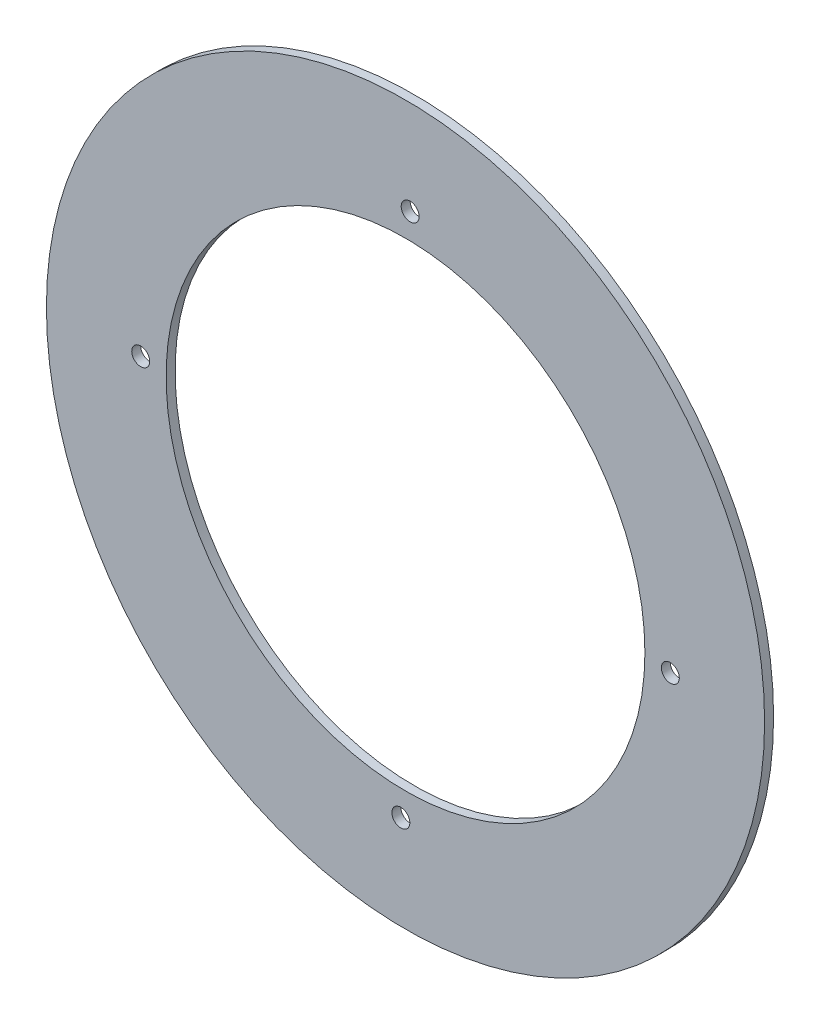
ISO-10303-21;
HEADER;
FILE_DESCRIPTION(('STEP AP214'),'2;1');
FILE_NAME('part.step','',(''),(''),'','','');
FILE_SCHEMA(('AUTOMOTIVE_DESIGN { 1 0 10303 214 1 1 1 1 }'));
ENDSEC;
DATA;
#1=APPLICATION_CONTEXT('core data for automotive mechanical design processes');
#2=APPLICATION_PROTOCOL_DEFINITION('international standard','automotive_design',2000,#1);
#3=PRODUCT_CONTEXT('',#1,'mechanical');
#4=PRODUCT('Part','Part','',(#3));
#5=PRODUCT_RELATED_PRODUCT_CATEGORY('part','',(#4));
#6=PRODUCT_DEFINITION_FORMATION('','',#4);
#7=PRODUCT_DEFINITION_CONTEXT('part definition',#1,'design');
#8=PRODUCT_DEFINITION('design','',#6,#7);
#9=PRODUCT_DEFINITION_SHAPE('','',#8);
#10=(LENGTH_UNIT() NAMED_UNIT(*) SI_UNIT(.MILLI.,.METRE.));
#11=(NAMED_UNIT(*) PLANE_ANGLE_UNIT() SI_UNIT($,.RADIAN.));
#12=(NAMED_UNIT(*) SI_UNIT($,.STERADIAN.) SOLID_ANGLE_UNIT());
#13=UNCERTAINTY_MEASURE_WITH_UNIT(LENGTH_MEASURE(1.E-05),#10,'distance_accuracy_value','');
#14=(GEOMETRIC_REPRESENTATION_CONTEXT(3) GLOBAL_UNCERTAINTY_ASSIGNED_CONTEXT((#13)) GLOBAL_UNIT_ASSIGNED_CONTEXT((#10,
#11,#12)) REPRESENTATION_CONTEXT('',''));
#15=CARTESIAN_POINT('',(0.,0.,0.));
#16=DIRECTION('',(0.,0.,1.));
#17=DIRECTION('',(1.,0.,0.));
#18=AXIS2_PLACEMENT_3D('',#15,#16,#17);
#19=CARTESIAN_POINT('',(0.,0.,1.5));
#20=DIRECTION('',(0.,0.,1.));
#21=DIRECTION('',(1.,0.,0.));
#22=AXIS2_PLACEMENT_3D('',#19,#20,#21);
#23=PLANE('',#22);
#24=CARTESIAN_POINT('',(44.2431366415532,-0.779333123157009,1.5));
#25=DIRECTION('',(0.,0.,1.));
#26=DIRECTION('',(1.,0.,0.));
#27=AXIS2_PLACEMENT_3D('',#24,#25,#26);
#28=CIRCLE('',#27,1.5);
#29=CARTESIAN_POINT('',(45.7431366415532,-0.779333123157009,1.5));
#30=VERTEX_POINT('',#29);
#31=EDGE_CURVE('E58',#30,#30,#28,.T.);
#32=ORIENTED_EDGE('',*,*,#31,.F.);
#33=EDGE_LOOP('',(#32));
#34=FACE_BOUND('',#33,.T.);
#35=CARTESIAN_POINT('',(0.779333123156854,44.2431366415532,1.5));
#36=DIRECTION('',(0.,0.,1.));
#37=DIRECTION('',(1.,0.,0.));
#38=AXIS2_PLACEMENT_3D('',#35,#36,#37);
#39=CIRCLE('',#38,1.5);
#40=CARTESIAN_POINT('',(2.27933312315686,44.2431366415532,1.5));
#41=VERTEX_POINT('',#40);
#42=EDGE_CURVE('E65',#41,#41,#39,.T.);
#43=ORIENTED_EDGE('',*,*,#42,.F.);
#44=EDGE_LOOP('',(#43));
#45=FACE_BOUND('',#44,.T.);
#46=CARTESIAN_POINT('',(-44.2431366415532,0.7793331231567,1.5));
#47=DIRECTION('',(0.,0.,1.));
#48=DIRECTION('',(1.,0.,0.));
#49=AXIS2_PLACEMENT_3D('',#46,#47,#48);
#50=CIRCLE('',#49,1.50000000000001);
#51=CARTESIAN_POINT('',(-42.7431366415532,0.7793331231567,1.5));
#52=VERTEX_POINT('',#51);
#53=EDGE_CURVE('E69',#52,#52,#50,.T.);
#54=ORIENTED_EDGE('',*,*,#53,.F.);
#55=EDGE_LOOP('',(#54));
#56=FACE_BOUND('',#55,.T.);
#57=CARTESIAN_POINT('',(-0.779333123156552,-44.2431366415532,1.5));
#58=DIRECTION('',(0.,0.,1.));
#59=DIRECTION('',(1.,0.,0.));
#60=AXIS2_PLACEMENT_3D('',#57,#58,#59);
#61=CIRCLE('',#60,1.5);
#62=CARTESIAN_POINT('',(0.720666876843447,-44.2431366415532,1.5));
#63=VERTEX_POINT('',#62);
#64=EDGE_CURVE('E73',#63,#63,#61,.T.);
#65=ORIENTED_EDGE('',*,*,#64,.F.);
#66=EDGE_LOOP('',(#65));
#67=FACE_BOUND('',#66,.T.);
#68=CARTESIAN_POINT('',(0.,0.,1.5));
#69=DIRECTION('',(0.,0.,1.));
#70=DIRECTION('',(1.,0.,0.));
#71=AXIS2_PLACEMENT_3D('',#68,#69,#70);
#72=CIRCLE('',#71,60.);
#73=CARTESIAN_POINT('',(60.,0.,1.5));
#74=VERTEX_POINT('',#73);
#75=EDGE_CURVE('E10',#74,#74,#72,.T.);
#76=ORIENTED_EDGE('',*,*,#75,.T.);
#77=EDGE_LOOP('',(#76));
#78=FACE_BOUND('',#77,.T.);
#79=CARTESIAN_POINT('',(0.,0.,1.5));
#80=DIRECTION('',(0.,0.,1.));
#81=DIRECTION('',(1.,0.,0.));
#82=AXIS2_PLACEMENT_3D('',#79,#80,#81);
#83=CIRCLE('',#82,40.);
#84=CARTESIAN_POINT('',(40.,0.,1.5));
#85=VERTEX_POINT('',#84);
#86=EDGE_CURVE('E52',#85,#85,#83,.T.);
#87=ORIENTED_EDGE('',*,*,#86,.F.);
#88=EDGE_LOOP('',(#87));
#89=FACE_BOUND('',#88,.T.);
#90=ADVANCED_FACE('F39',(#34,#45,#56,#67,#78,#89),#23,.T.);
#91=CARTESIAN_POINT('',(0.,0.,0.));
#92=DIRECTION('',(0.,0.,1.));
#93=DIRECTION('',(1.,0.,0.));
#94=AXIS2_PLACEMENT_3D('',#91,#92,#93);
#95=PLANE('',#94);
#96=CARTESIAN_POINT('',(44.2431366415532,-0.779333123157009,0.));
#97=DIRECTION('',(0.,0.,-1.));
#98=DIRECTION('',(-1.,0.,0.));
#99=AXIS2_PLACEMENT_3D('',#96,#97,#98);
#100=CIRCLE('',#99,1.5);
#101=CARTESIAN_POINT('',(42.7431366415532,-0.779333123157009,0.));
#102=VERTEX_POINT('',#101);
#103=EDGE_CURVE('E77',#102,#102,#100,.T.);
#104=ORIENTED_EDGE('',*,*,#103,.F.);
#105=EDGE_LOOP('',(#104));
#106=FACE_BOUND('',#105,.T.);
#107=CARTESIAN_POINT('',(0.779333123156854,44.2431366415532,0.));
#108=DIRECTION('',(0.,0.,-1.));
#109=DIRECTION('',(-1.,0.,0.));
#110=AXIS2_PLACEMENT_3D('',#107,#108,#109);
#111=CIRCLE('',#110,1.5);
#112=CARTESIAN_POINT('',(-0.720666876843148,44.2431366415532,0.));
#113=VERTEX_POINT('',#112);
#114=EDGE_CURVE('E86',#113,#113,#111,.T.);
#115=ORIENTED_EDGE('',*,*,#114,.F.);
#116=EDGE_LOOP('',(#115));
#117=FACE_BOUND('',#116,.T.);
#118=CARTESIAN_POINT('',(-44.2431366415532,0.7793331231567,0.));
#119=DIRECTION('',(0.,0.,-1.));
#120=DIRECTION('',(-1.,0.,0.));
#121=AXIS2_PLACEMENT_3D('',#118,#119,#120);
#122=CIRCLE('',#121,1.50000000000001);
#123=CARTESIAN_POINT('',(-45.7431366415533,0.7793331231567,0.));
#124=VERTEX_POINT('',#123);
#125=EDGE_CURVE('E82',#124,#124,#122,.T.);
#126=ORIENTED_EDGE('',*,*,#125,.F.);
#127=EDGE_LOOP('',(#126));
#128=FACE_BOUND('',#127,.T.);
#129=CARTESIAN_POINT('',(-0.779333123156552,-44.2431366415532,0.));
#130=DIRECTION('',(0.,0.,-1.));
#131=DIRECTION('',(-1.,0.,0.));
#132=AXIS2_PLACEMENT_3D('',#129,#130,#131);
#133=CIRCLE('',#132,1.5);
#134=CARTESIAN_POINT('',(-2.27933312315655,-44.2431366415532,0.));
#135=VERTEX_POINT('',#134);
#136=EDGE_CURVE('E78',#135,#135,#133,.T.);
#137=ORIENTED_EDGE('',*,*,#136,.F.);
#138=EDGE_LOOP('',(#137));
#139=FACE_BOUND('',#138,.T.);
#140=CARTESIAN_POINT('',(0.,0.,0.));
#141=DIRECTION('',(0.,0.,1.));
#142=DIRECTION('',(1.,0.,0.));
#143=AXIS2_PLACEMENT_3D('',#140,#141,#142);
#144=CIRCLE('',#143,60.);
#145=CARTESIAN_POINT('',(60.,0.,0.));
#146=VERTEX_POINT('',#145);
#147=EDGE_CURVE('E43',#146,#146,#144,.T.);
#148=ORIENTED_EDGE('',*,*,#147,.F.);
#149=EDGE_LOOP('',(#148));
#150=FACE_BOUND('',#149,.T.);
#151=CARTESIAN_POINT('',(0.,0.,0.));
#152=DIRECTION('',(0.,0.,1.));
#153=DIRECTION('',(1.,0.,0.));
#154=AXIS2_PLACEMENT_3D('',#151,#152,#153);
#155=CIRCLE('',#154,40.);
#156=CARTESIAN_POINT('',(40.,0.,0.));
#157=VERTEX_POINT('',#156);
#158=EDGE_CURVE('E54',#157,#157,#155,.T.);
#159=ORIENTED_EDGE('',*,*,#158,.T.);
#160=EDGE_LOOP('',(#159));
#161=FACE_BOUND('',#160,.T.);
#162=ADVANCED_FACE('F96',(#106,#117,#128,#139,#150,#161),#95,.F.);
#163=CARTESIAN_POINT('',(0.,0.,1.5));
#164=DIRECTION('',(0.,0.,-1.));
#165=DIRECTION('',(-1.,0.,0.));
#166=AXIS2_PLACEMENT_3D('',#163,#164,#165);
#167=CYLINDRICAL_SURFACE('',#166,60.);
#168=ORIENTED_EDGE('',*,*,#75,.F.);
#169=EDGE_LOOP('',(#168));
#170=FACE_BOUND('',#169,.T.);
#171=ORIENTED_EDGE('',*,*,#147,.T.);
#172=EDGE_LOOP('',(#171));
#173=FACE_BOUND('',#172,.T.);
#174=ADVANCED_FACE('F41',(#170,#173),#167,.T.);
#175=CARTESIAN_POINT('',(0.,0.,1.5));
#176=DIRECTION('',(0.,0.,-1.));
#177=DIRECTION('',(-1.,0.,0.));
#178=AXIS2_PLACEMENT_3D('',#175,#176,#177);
#179=CYLINDRICAL_SURFACE('',#178,40.);
#180=ORIENTED_EDGE('',*,*,#86,.T.);
#181=EDGE_LOOP('',(#180));
#182=FACE_BOUND('',#181,.T.);
#183=ORIENTED_EDGE('',*,*,#158,.F.);
#184=EDGE_LOOP('',(#183));
#185=FACE_BOUND('',#184,.T.);
#186=ADVANCED_FACE('F109',(#182,#185),#179,.F.);
#187=CARTESIAN_POINT('',(-0.779333123156552,-44.2431366415532,2.));
#188=DIRECTION('',(0.,0.,-1.));
#189=DIRECTION('',(-1.,0.,0.));
#190=AXIS2_PLACEMENT_3D('',#187,#188,#189);
#191=CYLINDRICAL_SURFACE('',#190,1.5);
#192=ORIENTED_EDGE('',*,*,#64,.T.);
#193=EDGE_LOOP('',(#192));
#194=FACE_BOUND('',#193,.T.);
#195=ORIENTED_EDGE('',*,*,#136,.T.);
#196=EDGE_LOOP('',(#195));
#197=FACE_BOUND('',#196,.T.);
#198=ADVANCED_FACE('F111',(#194,#197),#191,.F.);
#199=CARTESIAN_POINT('',(-44.2431366415532,0.7793331231567,2.));
#200=DIRECTION('',(0.,0.,-1.));
#201=DIRECTION('',(-1.,0.,0.));
#202=AXIS2_PLACEMENT_3D('',#199,#200,#201);
#203=CYLINDRICAL_SURFACE('',#202,1.50000000000001);
#204=ORIENTED_EDGE('',*,*,#53,.T.);
#205=EDGE_LOOP('',(#204));
#206=FACE_BOUND('',#205,.T.);
#207=ORIENTED_EDGE('',*,*,#125,.T.);
#208=EDGE_LOOP('',(#207));
#209=FACE_BOUND('',#208,.T.);
#210=ADVANCED_FACE('F118',(#206,#209),#203,.F.);
#211=CARTESIAN_POINT('',(0.779333123156854,44.2431366415532,2.));
#212=DIRECTION('',(0.,0.,-1.));
#213=DIRECTION('',(-1.,0.,0.));
#214=AXIS2_PLACEMENT_3D('',#211,#212,#213);
#215=CYLINDRICAL_SURFACE('',#214,1.5);
#216=ORIENTED_EDGE('',*,*,#42,.T.);
#217=EDGE_LOOP('',(#216));
#218=FACE_BOUND('',#217,.T.);
#219=ORIENTED_EDGE('',*,*,#114,.T.);
#220=EDGE_LOOP('',(#219));
#221=FACE_BOUND('',#220,.T.);
#222=ADVANCED_FACE('F140',(#218,#221),#215,.F.);
#223=CARTESIAN_POINT('',(44.2431366415532,-0.779333123157009,2.));
#224=DIRECTION('',(0.,0.,-1.));
#225=DIRECTION('',(-1.,0.,0.));
#226=AXIS2_PLACEMENT_3D('',#223,#224,#225);
#227=CYLINDRICAL_SURFACE('',#226,1.5);
#228=ORIENTED_EDGE('',*,*,#31,.T.);
#229=EDGE_LOOP('',(#228));
#230=FACE_BOUND('',#229,.T.);
#231=ORIENTED_EDGE('',*,*,#103,.T.);
#232=EDGE_LOOP('',(#231));
#233=FACE_BOUND('',#232,.T.);
#234=ADVANCED_FACE('F94',(#230,#233),#227,.F.);
#235=CLOSED_SHELL('',(#90,#162,#174,#186,#198,#210,#222,#234));
#236=MANIFOLD_SOLID_BREP('B2',#235);
#237=ADVANCED_BREP_SHAPE_REPRESENTATION('',(#18,#236),#14);
#238=SHAPE_DEFINITION_REPRESENTATION(#9,#237);
ENDSEC;
END-ISO-10303-21;
